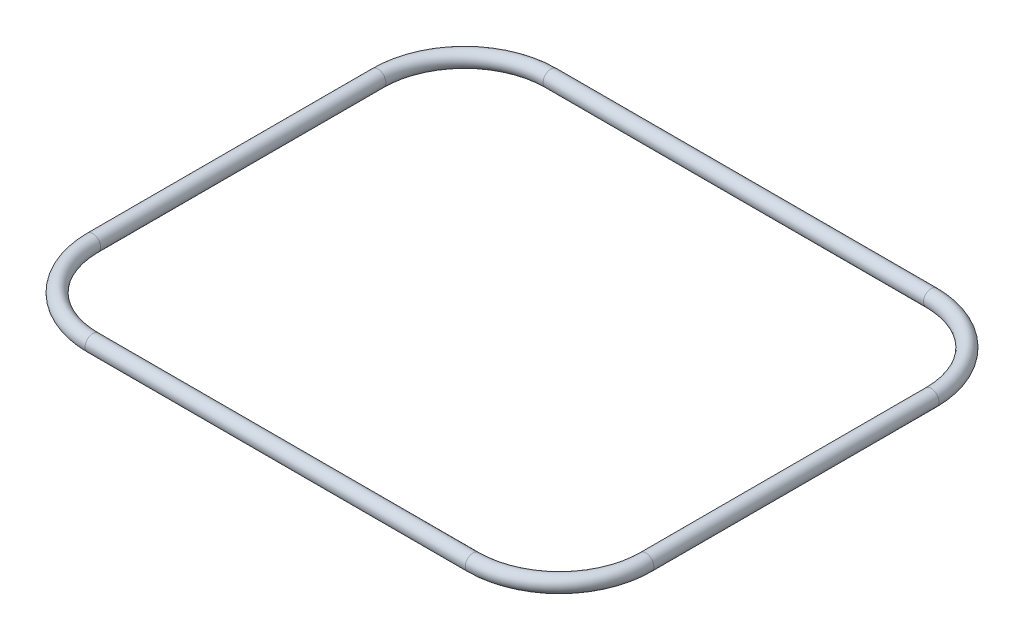
ISO-10303-21;
HEADER;
FILE_DESCRIPTION(('STEP AP214'),'2;1');
FILE_NAME('part.step','',(''),(''),'','','');
FILE_SCHEMA(('AUTOMOTIVE_DESIGN { 1 0 10303 214 1 1 1 1 }'));
ENDSEC;
DATA;
#1=APPLICATION_CONTEXT('core data for automotive mechanical design processes');
#2=APPLICATION_PROTOCOL_DEFINITION('international standard','automotive_design',2000,#1);
#3=PRODUCT_CONTEXT('',#1,'mechanical');
#4=PRODUCT('Part','Part','',(#3));
#5=PRODUCT_RELATED_PRODUCT_CATEGORY('part','',(#4));
#6=PRODUCT_DEFINITION_FORMATION('','',#4);
#7=PRODUCT_DEFINITION_CONTEXT('part definition',#1,'design');
#8=PRODUCT_DEFINITION('design','',#6,#7);
#9=PRODUCT_DEFINITION_SHAPE('','',#8);
#10=(LENGTH_UNIT() NAMED_UNIT(*) SI_UNIT(.MILLI.,.METRE.));
#11=(NAMED_UNIT(*) PLANE_ANGLE_UNIT() SI_UNIT($,.RADIAN.));
#12=(NAMED_UNIT(*) SI_UNIT($,.STERADIAN.) SOLID_ANGLE_UNIT());
#13=UNCERTAINTY_MEASURE_WITH_UNIT(LENGTH_MEASURE(1.E-05),#10,'distance_accuracy_value','');
#14=(GEOMETRIC_REPRESENTATION_CONTEXT(3) GLOBAL_UNCERTAINTY_ASSIGNED_CONTEXT((#13)) GLOBAL_UNIT_ASSIGNED_CONTEXT((#10,
#11,#12)) REPRESENTATION_CONTEXT('',''));
#15=CARTESIAN_POINT('',(0.,0.,0.));
#16=DIRECTION('',(0.,0.,1.));
#17=DIRECTION('',(1.,0.,0.));
#18=AXIS2_PLACEMENT_3D('',#15,#16,#17);
#19=CARTESIAN_POINT('',(505.510652388512,381.320302831157,314.26));
#20=DIRECTION('',(1.,0.,0.));
#21=DIRECTION('',(0.,0.,-1.));
#22=AXIS2_PLACEMENT_3D('',#19,#20,#21);
#23=CYLINDRICAL_SURFACE('',#22,1.190625);
#24=CARTESIAN_POINT('',(505.510652388512,381.320302831157,314.26));
#25=DIRECTION('',(-1.,0.,0.));
#26=DIRECTION('',(0.,0.,-1.));
#27=AXIS2_PLACEMENT_3D('',#24,#25,#26);
#28=CIRCLE('',#27,1.190625);
#29=CARTESIAN_POINT('',(505.510652388512,381.320302831157,313.069375));
#30=VERTEX_POINT('',#29);
#31=EDGE_CURVE('E17',#30,#30,#28,.F.);
#32=ORIENTED_EDGE('',*,*,#31,.F.);
#33=EDGE_LOOP('',(#32));
#34=FACE_BOUND('',#33,.T.);
#35=CARTESIAN_POINT('',(447.510652388512,381.320302831157,314.26));
#36=DIRECTION('',(-1.,0.,0.));
#37=DIRECTION('',(0.,0.,-1.));
#38=AXIS2_PLACEMENT_3D('',#35,#36,#37);
#39=CIRCLE('',#38,1.190625);
#40=CARTESIAN_POINT('',(447.510652388512,381.320302831157,313.069375));
#41=VERTEX_POINT('',#40);
#42=EDGE_CURVE('E63',#41,#41,#39,.T.);
#43=ORIENTED_EDGE('',*,*,#42,.F.);
#44=EDGE_LOOP('',(#43));
#45=FACE_BOUND('',#44,.T.);
#46=ADVANCED_FACE('F14',(#34,#45),#23,.T.);
#47=CARTESIAN_POINT('',(505.510652388512,381.320302831157,327.45));
#48=DIRECTION('',(0.,1.,0.));
#49=DIRECTION('',(1.,0.,0.));
#50=AXIS2_PLACEMENT_3D('',#47,#48,#49);
#51=TOROIDAL_SURFACE('',#50,13.1900000000001,1.190625);
#52=CARTESIAN_POINT('',(518.700652388512,381.320302831157,327.45));
#53=DIRECTION('',(0.,0.,1.));
#54=DIRECTION('',(1.,0.,0.));
#55=AXIS2_PLACEMENT_3D('',#52,#53,#54);
#56=CIRCLE('',#55,1.190625);
#57=CARTESIAN_POINT('',(519.891277388512,381.320302831157,327.45));
#58=VERTEX_POINT('',#57);
#59=EDGE_CURVE('E59',#58,#58,#56,.T.);
#60=ORIENTED_EDGE('',*,*,#59,.F.);
#61=EDGE_LOOP('',(#60));
#62=FACE_BOUND('',#61,.T.);
#63=ORIENTED_EDGE('',*,*,#31,.T.);
#64=EDGE_LOOP('',(#63));
#65=FACE_BOUND('',#64,.T.);
#66=ADVANCED_FACE('F70',(#62,#65),#51,.T.);
#67=CARTESIAN_POINT('',(447.510652388512,381.320302831157,327.45));
#68=DIRECTION('',(0.,1.,0.));
#69=DIRECTION('',(0.,0.,-1.));
#70=AXIS2_PLACEMENT_3D('',#67,#68,#69);
#71=TOROIDAL_SURFACE('',#70,13.19,1.190625);
#72=ORIENTED_EDGE('',*,*,#42,.T.);
#73=EDGE_LOOP('',(#72));
#74=FACE_BOUND('',#73,.T.);
#75=CARTESIAN_POINT('',(434.320652388512,381.320302831157,327.45));
#76=DIRECTION('',(0.,0.,-1.));
#77=DIRECTION('',(-1.,0.,0.));
#78=AXIS2_PLACEMENT_3D('',#75,#76,#77);
#79=CIRCLE('',#78,1.190625);
#80=CARTESIAN_POINT('',(433.130027388512,381.320302831157,327.45));
#81=VERTEX_POINT('',#80);
#82=EDGE_CURVE('E55',#81,#81,#79,.F.);
#83=ORIENTED_EDGE('',*,*,#82,.F.);
#84=EDGE_LOOP('',(#83));
#85=FACE_BOUND('',#84,.T.);
#86=ADVANCED_FACE('F67',(#74,#85),#71,.T.);
#87=CARTESIAN_POINT('',(518.700652388512,381.320302831157,370.95));
#88=DIRECTION('',(0.,0.,1.));
#89=DIRECTION('',(1.,0.,0.));
#90=AXIS2_PLACEMENT_3D('',#87,#88,#89);
#91=CYLINDRICAL_SURFACE('',#90,1.190625);
#92=CARTESIAN_POINT('',(518.700652388512,381.320302831157,370.95));
#93=DIRECTION('',(0.,0.,-1.));
#94=DIRECTION('',(1.,0.,0.));
#95=AXIS2_PLACEMENT_3D('',#92,#93,#94);
#96=CIRCLE('',#95,1.190625);
#97=CARTESIAN_POINT('',(519.891277388512,381.320302831157,370.95));
#98=VERTEX_POINT('',#97);
#99=EDGE_CURVE('E51',#98,#98,#96,.F.);
#100=ORIENTED_EDGE('',*,*,#99,.F.);
#101=EDGE_LOOP('',(#100));
#102=FACE_BOUND('',#101,.T.);
#103=ORIENTED_EDGE('',*,*,#59,.T.);
#104=EDGE_LOOP('',(#103));
#105=FACE_BOUND('',#104,.T.);
#106=ADVANCED_FACE('F69',(#102,#105),#91,.T.);
#107=CARTESIAN_POINT('',(434.320652388512,381.320302831157,327.45));
#108=DIRECTION('',(0.,0.,-1.));
#109=DIRECTION('',(-1.,0.,0.));
#110=AXIS2_PLACEMENT_3D('',#107,#108,#109);
#111=CYLINDRICAL_SURFACE('',#110,1.190625);
#112=ORIENTED_EDGE('',*,*,#82,.T.);
#113=EDGE_LOOP('',(#112));
#114=FACE_BOUND('',#113,.T.);
#115=CARTESIAN_POINT('',(434.320652388512,381.320302831157,370.95));
#116=DIRECTION('',(0.,0.,1.));
#117=DIRECTION('',(-1.,0.,0.));
#118=AXIS2_PLACEMENT_3D('',#115,#116,#117);
#119=CIRCLE('',#118,1.190625);
#120=CARTESIAN_POINT('',(433.130027388512,381.320302831157,370.95));
#121=VERTEX_POINT('',#120);
#122=EDGE_CURVE('E30',#121,#121,#119,.T.);
#123=ORIENTED_EDGE('',*,*,#122,.F.);
#124=EDGE_LOOP('',(#123));
#125=FACE_BOUND('',#124,.T.);
#126=ADVANCED_FACE('F46',(#114,#125),#111,.T.);
#127=CARTESIAN_POINT('',(505.510652388512,381.320302831157,370.95));
#128=DIRECTION('',(0.,1.,0.));
#129=DIRECTION('',(0.,0.,1.));
#130=AXIS2_PLACEMENT_3D('',#127,#128,#129);
#131=TOROIDAL_SURFACE('',#130,13.19,1.190625);
#132=CARTESIAN_POINT('',(505.510652388512,381.320302831157,384.14));
#133=DIRECTION('',(-1.,0.,0.));
#134=DIRECTION('',(0.,0.,1.));
#135=AXIS2_PLACEMENT_3D('',#132,#133,#134);
#136=CIRCLE('',#135,1.190625);
#137=CARTESIAN_POINT('',(505.510652388512,381.320302831157,385.330625));
#138=VERTEX_POINT('',#137);
#139=EDGE_CURVE('E22',#138,#138,#136,.T.);
#140=ORIENTED_EDGE('',*,*,#139,.F.);
#141=EDGE_LOOP('',(#140));
#142=FACE_BOUND('',#141,.T.);
#143=ORIENTED_EDGE('',*,*,#99,.T.);
#144=EDGE_LOOP('',(#143));
#145=FACE_BOUND('',#144,.T.);
#146=ADVANCED_FACE('F42',(#142,#145),#131,.T.);
#147=CARTESIAN_POINT('',(447.510652388512,381.320302831157,370.95));
#148=DIRECTION('',(0.,1.,0.));
#149=DIRECTION('',(-1.,0.,0.));
#150=AXIS2_PLACEMENT_3D('',#147,#148,#149);
#151=TOROIDAL_SURFACE('',#150,13.19,1.190625);
#152=ORIENTED_EDGE('',*,*,#122,.T.);
#153=EDGE_LOOP('',(#152));
#154=FACE_BOUND('',#153,.T.);
#155=CARTESIAN_POINT('',(447.510652388512,381.320302831157,384.14));
#156=DIRECTION('',(-1.,0.,0.));
#157=DIRECTION('',(0.,0.,1.));
#158=AXIS2_PLACEMENT_3D('',#155,#156,#157);
#159=CIRCLE('',#158,1.190625);
#160=CARTESIAN_POINT('',(447.510652388512,381.320302831157,385.330625));
#161=VERTEX_POINT('',#160);
#162=EDGE_CURVE('E10',#161,#161,#159,.F.);
#163=ORIENTED_EDGE('',*,*,#162,.F.);
#164=EDGE_LOOP('',(#163));
#165=FACE_BOUND('',#164,.T.);
#166=ADVANCED_FACE('F37',(#154,#165),#151,.T.);
#167=CARTESIAN_POINT('',(466.510652388512,381.320302831157,384.14));
#168=DIRECTION('',(-1.,0.,0.));
#169=DIRECTION('',(0.,0.,1.));
#170=AXIS2_PLACEMENT_3D('',#167,#168,#169);
#171=CYLINDRICAL_SURFACE('',#170,1.190625);
#172=ORIENTED_EDGE('',*,*,#162,.T.);
#173=EDGE_LOOP('',(#172));
#174=FACE_BOUND('',#173,.T.);
#175=ORIENTED_EDGE('',*,*,#139,.T.);
#176=EDGE_LOOP('',(#175));
#177=FACE_BOUND('',#176,.T.);
#178=ADVANCED_FACE('F41',(#174,#177),#171,.T.);
#179=CLOSED_SHELL('',(#46,#66,#86,#106,#126,#146,#166,#178));
#180=MANIFOLD_SOLID_BREP('B1',#179);
#181=ADVANCED_BREP_SHAPE_REPRESENTATION('',(#18,#180),#14);
#182=SHAPE_DEFINITION_REPRESENTATION(#9,#181);
ENDSEC;
END-ISO-10303-21;
